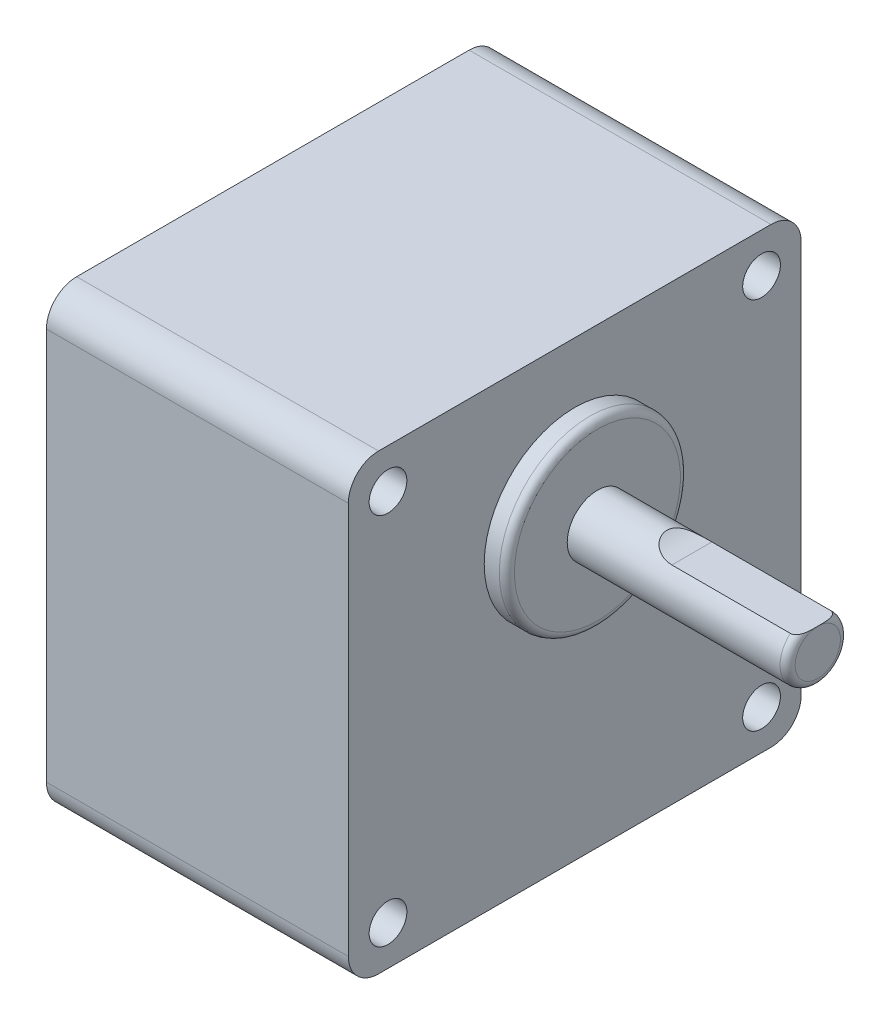
ISO-10303-21;
HEADER;
FILE_DESCRIPTION(('STEP AP214'),'2;1');
FILE_NAME('part.step','',(''),(''),'','','');
FILE_SCHEMA(('AUTOMOTIVE_DESIGN { 1 0 10303 214 1 1 1 1 }'));
ENDSEC;
DATA;
#1=APPLICATION_CONTEXT('core data for automotive mechanical design processes');
#2=APPLICATION_PROTOCOL_DEFINITION('international standard','automotive_design',2000,#1);
#3=PRODUCT_CONTEXT('',#1,'mechanical');
#4=PRODUCT('Part','Part','',(#3));
#5=PRODUCT_RELATED_PRODUCT_CATEGORY('part','',(#4));
#6=PRODUCT_DEFINITION_FORMATION('','',#4);
#7=PRODUCT_DEFINITION_CONTEXT('part definition',#1,'design');
#8=PRODUCT_DEFINITION('design','',#6,#7);
#9=PRODUCT_DEFINITION_SHAPE('','',#8);
#10=(LENGTH_UNIT() NAMED_UNIT(*) SI_UNIT(.MILLI.,.METRE.));
#11=(NAMED_UNIT(*) PLANE_ANGLE_UNIT() SI_UNIT($,.RADIAN.));
#12=(NAMED_UNIT(*) SI_UNIT($,.STERADIAN.) SOLID_ANGLE_UNIT());
#13=UNCERTAINTY_MEASURE_WITH_UNIT(LENGTH_MEASURE(1.E-05),#10,'distance_accuracy_value','');
#14=(GEOMETRIC_REPRESENTATION_CONTEXT(3) GLOBAL_UNCERTAINTY_ASSIGNED_CONTEXT((#13)) GLOBAL_UNIT_ASSIGNED_CONTEXT((#10,
#11,#12)) REPRESENTATION_CONTEXT('',''));
#15=CARTESIAN_POINT('',(0.,0.,0.));
#16=DIRECTION('',(0.,0.,1.));
#17=DIRECTION('',(1.,0.,0.));
#18=AXIS2_PLACEMENT_3D('',#15,#16,#17);
#19=CARTESIAN_POINT('',(-3.,0.,0.));
#20=DIRECTION('',(1.,0.,0.));
#21=DIRECTION('',(0.,0.,-1.));
#22=AXIS2_PLACEMENT_3D('',#19,#20,#21);
#23=PLANE('',#22);
#24=DIRECTION('',(0.,0.,-1.));
#25=VECTOR('',#24,1.);
#26=CARTESIAN_POINT('',(-3.,-40.,30.));
#27=LINE('',#26,#25);
#28=CARTESIAN_POINT('',(-3.,-40.,26.));
#29=VERTEX_POINT('',#28);
#30=CARTESIAN_POINT('',(-3.,-40.,-26.));
#31=VERTEX_POINT('',#30);
#32=EDGE_CURVE('E272',#29,#31,#27,.T.);
#33=ORIENTED_EDGE('',*,*,#32,.T.);
#34=CARTESIAN_POINT('',(-3.,-36.,-26.));
#35=DIRECTION('',(1.,0.,0.));
#36=DIRECTION('',(0.,0.,-1.));
#37=AXIS2_PLACEMENT_3D('',#34,#35,#36);
#38=CIRCLE('',#37,4.);
#39=CARTESIAN_POINT('',(-3.,-36.,-30.));
#40=VERTEX_POINT('',#39);
#41=EDGE_CURVE('E285',#31,#40,#38,.T.);
#42=ORIENTED_EDGE('',*,*,#41,.T.);
#43=DIRECTION('',(0.,1.,0.));
#44=VECTOR('',#43,1.);
#45=CARTESIAN_POINT('',(-3.,20.,-30.));
#46=LINE('',#45,#44);
#47=CARTESIAN_POINT('',(-3.,16.,-30.));
#48=VERTEX_POINT('',#47);
#49=EDGE_CURVE('E267',#40,#48,#46,.T.);
#50=ORIENTED_EDGE('',*,*,#49,.T.);
#51=CARTESIAN_POINT('',(-3.,16.,-26.));
#52=DIRECTION('',(1.,0.,0.));
#53=DIRECTION('',(0.,0.,-1.));
#54=AXIS2_PLACEMENT_3D('',#51,#52,#53);
#55=CIRCLE('',#54,4.);
#56=CARTESIAN_POINT('',(-3.,20.,-26.));
#57=VERTEX_POINT('',#56);
#58=EDGE_CURVE('E265',#48,#57,#55,.T.);
#59=ORIENTED_EDGE('',*,*,#58,.T.);
#60=DIRECTION('',(0.,0.,1.));
#61=VECTOR('',#60,1.);
#62=CARTESIAN_POINT('',(-3.,20.,30.));
#63=LINE('',#62,#61);
#64=CARTESIAN_POINT('',(-3.,20.,26.));
#65=VERTEX_POINT('',#64);
#66=EDGE_CURVE('E257',#57,#65,#63,.T.);
#67=ORIENTED_EDGE('',*,*,#66,.T.);
#68=CARTESIAN_POINT('',(-3.,16.,26.));
#69=DIRECTION('',(1.,0.,0.));
#70=DIRECTION('',(0.,0.,-1.));
#71=AXIS2_PLACEMENT_3D('',#68,#69,#70);
#72=CIRCLE('',#71,4.);
#73=CARTESIAN_POINT('',(-3.,16.,30.));
#74=VERTEX_POINT('',#73);
#75=EDGE_CURVE('E262',#65,#74,#72,.T.);
#76=ORIENTED_EDGE('',*,*,#75,.T.);
#77=DIRECTION('',(0.,-1.,0.));
#78=VECTOR('',#77,1.);
#79=CARTESIAN_POINT('',(-3.,20.,30.));
#80=LINE('',#79,#78);
#81=CARTESIAN_POINT('',(-3.,-36.,30.));
#82=VERTEX_POINT('',#81);
#83=EDGE_CURVE('E301',#74,#82,#80,.T.);
#84=ORIENTED_EDGE('',*,*,#83,.T.);
#85=CARTESIAN_POINT('',(-3.,-36.,26.));
#86=DIRECTION('',(1.,0.,0.));
#87=DIRECTION('',(0.,0.,-1.));
#88=AXIS2_PLACEMENT_3D('',#85,#86,#87);
#89=CIRCLE('',#88,4.);
#90=EDGE_CURVE('E283',#82,#29,#89,.T.);
#91=ORIENTED_EDGE('',*,*,#90,.T.);
#92=EDGE_LOOP('',(#33,#42,#50,#59,#67,#76,#84,#91));
#93=FACE_BOUND('',#92,.T.);
#94=CARTESIAN_POINT('',(-3.,14.75,24.7474746186353));
#95=DIRECTION('',(1.,0.,0.));
#96=DIRECTION('',(0.,0.,-1.));
#97=AXIS2_PLACEMENT_3D('',#94,#95,#96);
#98=CIRCLE('',#97,2.5);
#99=CARTESIAN_POINT('',(-3.,14.75,22.2474746186353));
#100=VERTEX_POINT('',#99);
#101=EDGE_CURVE('E304',#100,#100,#98,.T.);
#102=ORIENTED_EDGE('',*,*,#101,.F.);
#103=EDGE_LOOP('',(#102));
#104=FACE_BOUND('',#103,.T.);
#105=CARTESIAN_POINT('',(-3.,14.75,-24.7474746186353));
#106=DIRECTION('',(1.,0.,0.));
#107=DIRECTION('',(0.,0.,-1.));
#108=AXIS2_PLACEMENT_3D('',#105,#106,#107);
#109=CIRCLE('',#108,2.5);
#110=CARTESIAN_POINT('',(-3.,14.75,-27.2474746186353));
#111=VERTEX_POINT('',#110);
#112=EDGE_CURVE('E311',#111,#111,#109,.T.);
#113=ORIENTED_EDGE('',*,*,#112,.F.);
#114=EDGE_LOOP('',(#113));
#115=FACE_BOUND('',#114,.T.);
#116=CARTESIAN_POINT('',(-3.,-34.75,-24.7474746186353));
#117=DIRECTION('',(1.,0.,0.));
#118=DIRECTION('',(0.,0.,-1.));
#119=AXIS2_PLACEMENT_3D('',#116,#117,#118);
#120=CIRCLE('',#119,2.5);
#121=CARTESIAN_POINT('',(-3.,-34.75,-27.2474746186353));
#122=VERTEX_POINT('',#121);
#123=EDGE_CURVE('E317',#122,#122,#120,.T.);
#124=ORIENTED_EDGE('',*,*,#123,.F.);
#125=EDGE_LOOP('',(#124));
#126=FACE_BOUND('',#125,.T.);
#127=CARTESIAN_POINT('',(-3.,-34.75,24.7474746186353));
#128=DIRECTION('',(1.,0.,0.));
#129=DIRECTION('',(0.,0.,-1.));
#130=AXIS2_PLACEMENT_3D('',#127,#128,#129);
#131=CIRCLE('',#130,2.5);
#132=CARTESIAN_POINT('',(-3.,-34.75,22.2474746186353));
#133=VERTEX_POINT('',#132);
#134=EDGE_CURVE('E323',#133,#133,#131,.T.);
#135=ORIENTED_EDGE('',*,*,#134,.F.);
#136=EDGE_LOOP('',(#135));
#137=FACE_BOUND('',#136,.T.);
#138=CARTESIAN_POINT('',(-3.,0.,0.));
#139=DIRECTION('',(-1.,0.,0.));
#140=DIRECTION('',(0.,0.,1.));
#141=AXIS2_PLACEMENT_3D('',#138,#139,#140);
#142=CIRCLE('',#141,12.);
#143=CARTESIAN_POINT('',(-3.,0.,12.));
#144=VERTEX_POINT('',#143);
#145=EDGE_CURVE('E326',#144,#144,#142,.T.);
#146=ORIENTED_EDGE('',*,*,#145,.T.);
#147=EDGE_LOOP('',(#146));
#148=FACE_BOUND('',#147,.T.);
#149=ADVANCED_FACE('F36',(#93,#104,#115,#126,#137,#148),#23,.T.);
#150=CARTESIAN_POINT('',(-43.,20.,30.));
#151=DIRECTION('',(0.,0.,1.));
#152=DIRECTION('',(0.,-1.,0.));
#153=AXIS2_PLACEMENT_3D('',#150,#151,#152);
#154=PLANE('',#153);
#155=DIRECTION('',(0.,-1.,0.));
#156=VECTOR('',#155,1.);
#157=CARTESIAN_POINT('',(-43.,20.,30.));
#158=LINE('',#157,#156);
#159=CARTESIAN_POINT('',(-43.,16.,30.));
#160=VERTEX_POINT('',#159);
#161=CARTESIAN_POINT('',(-43.,-36.,30.));
#162=VERTEX_POINT('',#161);
#163=EDGE_CURVE('E266',#160,#162,#158,.T.);
#164=ORIENTED_EDGE('',*,*,#163,.T.);
#165=DIRECTION('',(1.,0.,0.));
#166=VECTOR('',#165,1.);
#167=CARTESIAN_POINT('',(-43.,-36.,30.));
#168=LINE('',#167,#166);
#169=EDGE_CURVE('E250',#162,#82,#168,.T.);
#170=ORIENTED_EDGE('',*,*,#169,.T.);
#171=ORIENTED_EDGE('',*,*,#83,.F.);
#172=DIRECTION('',(1.,0.,0.));
#173=VECTOR('',#172,1.);
#174=CARTESIAN_POINT('',(-43.,16.,30.));
#175=LINE('',#174,#173);
#176=EDGE_CURVE('E248',#74,#160,#175,.F.);
#177=ORIENTED_EDGE('',*,*,#176,.T.);
#178=EDGE_LOOP('',(#164,#170,#171,#177));
#179=FACE_BOUND('',#178,.T.);
#180=ADVANCED_FACE('F199',(#179),#154,.T.);
#181=CARTESIAN_POINT('',(-43.,20.,30.));
#182=DIRECTION('',(0.,1.,0.));
#183=DIRECTION('',(0.,0.,1.));
#184=AXIS2_PLACEMENT_3D('',#181,#182,#183);
#185=PLANE('',#184);
#186=DIRECTION('',(0.,0.,1.));
#187=VECTOR('',#186,1.);
#188=CARTESIAN_POINT('',(-43.,20.,30.));
#189=LINE('',#188,#187);
#190=CARTESIAN_POINT('',(-43.,20.,-26.));
#191=VERTEX_POINT('',#190);
#192=CARTESIAN_POINT('',(-43.,20.,26.));
#193=VERTEX_POINT('',#192);
#194=EDGE_CURVE('E258',#191,#193,#189,.T.);
#195=ORIENTED_EDGE('',*,*,#194,.T.);
#196=DIRECTION('',(1.,0.,0.));
#197=VECTOR('',#196,1.);
#198=CARTESIAN_POINT('',(-43.,20.,26.));
#199=LINE('',#198,#197);
#200=EDGE_CURVE('E140',#193,#65,#199,.T.);
#201=ORIENTED_EDGE('',*,*,#200,.T.);
#202=ORIENTED_EDGE('',*,*,#66,.F.);
#203=DIRECTION('',(1.,0.,0.));
#204=VECTOR('',#203,1.);
#205=CARTESIAN_POINT('',(-43.,20.,-26.));
#206=LINE('',#205,#204);
#207=EDGE_CURVE('E233',#57,#191,#206,.F.);
#208=ORIENTED_EDGE('',*,*,#207,.T.);
#209=EDGE_LOOP('',(#195,#201,#202,#208));
#210=FACE_BOUND('',#209,.T.);
#211=ADVANCED_FACE('F201',(#210),#185,.T.);
#212=CARTESIAN_POINT('',(-43.,20.,-30.));
#213=DIRECTION('',(0.,0.,-1.));
#214=DIRECTION('',(0.,1.,0.));
#215=AXIS2_PLACEMENT_3D('',#212,#213,#214);
#216=PLANE('',#215);
#217=ORIENTED_EDGE('',*,*,#49,.F.);
#218=DIRECTION('',(1.,0.,0.));
#219=VECTOR('',#218,1.);
#220=CARTESIAN_POINT('',(-43.,-36.,-30.));
#221=LINE('',#220,#219);
#222=CARTESIAN_POINT('',(-43.,-36.,-30.));
#223=VERTEX_POINT('',#222);
#224=EDGE_CURVE('E238',#40,#223,#221,.F.);
#225=ORIENTED_EDGE('',*,*,#224,.T.);
#226=DIRECTION('',(0.,1.,0.));
#227=VECTOR('',#226,1.);
#228=CARTESIAN_POINT('',(-43.,20.,-30.));
#229=LINE('',#228,#227);
#230=CARTESIAN_POINT('',(-43.,16.,-30.));
#231=VERTEX_POINT('',#230);
#232=EDGE_CURVE('E288',#223,#231,#229,.T.);
#233=ORIENTED_EDGE('',*,*,#232,.T.);
#234=DIRECTION('',(1.,0.,0.));
#235=VECTOR('',#234,1.);
#236=CARTESIAN_POINT('',(-43.,16.,-30.));
#237=LINE('',#236,#235);
#238=EDGE_CURVE('E235',#231,#48,#237,.T.);
#239=ORIENTED_EDGE('',*,*,#238,.T.);
#240=EDGE_LOOP('',(#217,#225,#233,#239));
#241=FACE_BOUND('',#240,.T.);
#242=ADVANCED_FACE('F204',(#241),#216,.T.);
#243=CARTESIAN_POINT('',(-43.,-40.,30.));
#244=DIRECTION('',(0.,-1.,0.));
#245=DIRECTION('',(0.,0.,-1.));
#246=AXIS2_PLACEMENT_3D('',#243,#244,#245);
#247=PLANE('',#246);
#248=DIRECTION('',(0.,0.,-1.));
#249=VECTOR('',#248,1.);
#250=CARTESIAN_POINT('',(-43.,-40.,30.));
#251=LINE('',#250,#249);
#252=CARTESIAN_POINT('',(-43.,-40.,26.));
#253=VERTEX_POINT('',#252);
#254=CARTESIAN_POINT('',(-43.,-40.,-26.));
#255=VERTEX_POINT('',#254);
#256=EDGE_CURVE('E270',#253,#255,#251,.T.);
#257=ORIENTED_EDGE('',*,*,#256,.T.);
#258=DIRECTION('',(1.,0.,0.));
#259=VECTOR('',#258,1.);
#260=CARTESIAN_POINT('',(-43.,-40.,-26.));
#261=LINE('',#260,#259);
#262=EDGE_CURVE('E278',#255,#31,#261,.T.);
#263=ORIENTED_EDGE('',*,*,#262,.T.);
#264=ORIENTED_EDGE('',*,*,#32,.F.);
#265=DIRECTION('',(1.,0.,0.));
#266=VECTOR('',#265,1.);
#267=CARTESIAN_POINT('',(-43.,-40.,26.));
#268=LINE('',#267,#266);
#269=EDGE_CURVE('E276',#29,#253,#268,.F.);
#270=ORIENTED_EDGE('',*,*,#269,.T.);
#271=EDGE_LOOP('',(#257,#263,#264,#270));
#272=FACE_BOUND('',#271,.T.);
#273=ADVANCED_FACE('F195',(#272),#247,.T.);
#274=CARTESIAN_POINT('',(-43.,0.,0.));
#275=DIRECTION('',(1.,0.,0.));
#276=DIRECTION('',(0.,0.,-1.));
#277=AXIS2_PLACEMENT_3D('',#274,#275,#276);
#278=PLANE('',#277);
#279=CARTESIAN_POINT('',(-43.,-10.,0.));
#280=DIRECTION('',(1.,0.,0.));
#281=DIRECTION('',(0.,0.,-1.));
#282=AXIS2_PLACEMENT_3D('',#279,#280,#281);
#283=CIRCLE('',#282,27.);
#284=CARTESIAN_POINT('',(-43.,-10.,-27.));
#285=VERTEX_POINT('',#284);
#286=EDGE_CURVE('E342',#285,#285,#283,.T.);
#287=ORIENTED_EDGE('',*,*,#286,.T.);
#288=EDGE_LOOP('',(#287));
#289=FACE_BOUND('',#288,.T.);
#290=CARTESIAN_POINT('',(-43.,-34.75,24.7474746186353));
#291=DIRECTION('',(1.,0.,0.));
#292=DIRECTION('',(0.,0.,-1.));
#293=AXIS2_PLACEMENT_3D('',#290,#291,#292);
#294=CIRCLE('',#293,2.5);
#295=CARTESIAN_POINT('',(-43.,-34.75,22.2474746186353));
#296=VERTEX_POINT('',#295);
#297=EDGE_CURVE('E320',#296,#296,#294,.T.);
#298=ORIENTED_EDGE('',*,*,#297,.T.);
#299=EDGE_LOOP('',(#298));
#300=FACE_BOUND('',#299,.T.);
#301=CARTESIAN_POINT('',(-43.,-34.75,-24.7474746186353));
#302=DIRECTION('',(1.,0.,0.));
#303=DIRECTION('',(0.,0.,-1.));
#304=AXIS2_PLACEMENT_3D('',#301,#302,#303);
#305=CIRCLE('',#304,2.5);
#306=CARTESIAN_POINT('',(-43.,-34.75,-27.2474746186353));
#307=VERTEX_POINT('',#306);
#308=EDGE_CURVE('E314',#307,#307,#305,.T.);
#309=ORIENTED_EDGE('',*,*,#308,.T.);
#310=EDGE_LOOP('',(#309));
#311=FACE_BOUND('',#310,.T.);
#312=CARTESIAN_POINT('',(-43.,14.75,-24.7474746186353));
#313=DIRECTION('',(1.,0.,0.));
#314=DIRECTION('',(0.,0.,-1.));
#315=AXIS2_PLACEMENT_3D('',#312,#313,#314);
#316=CIRCLE('',#315,2.5);
#317=CARTESIAN_POINT('',(-43.,14.75,-27.2474746186353));
#318=VERTEX_POINT('',#317);
#319=EDGE_CURVE('E309',#318,#318,#316,.T.);
#320=ORIENTED_EDGE('',*,*,#319,.T.);
#321=EDGE_LOOP('',(#320));
#322=FACE_BOUND('',#321,.T.);
#323=CARTESIAN_POINT('',(-43.,14.75,24.7474746186353));
#324=DIRECTION('',(1.,0.,0.));
#325=DIRECTION('',(0.,0.,-1.));
#326=AXIS2_PLACEMENT_3D('',#323,#324,#325);
#327=CIRCLE('',#326,2.5);
#328=CARTESIAN_POINT('',(-43.,14.75,22.2474746186353));
#329=VERTEX_POINT('',#328);
#330=EDGE_CURVE('E302',#329,#329,#327,.T.);
#331=ORIENTED_EDGE('',*,*,#330,.T.);
#332=EDGE_LOOP('',(#331));
#333=FACE_BOUND('',#332,.T.);
#334=ORIENTED_EDGE('',*,*,#232,.F.);
#335=CARTESIAN_POINT('',(-43.,-36.,-26.));
#336=DIRECTION('',(1.,0.,0.));
#337=DIRECTION('',(0.,0.,-1.));
#338=AXIS2_PLACEMENT_3D('',#335,#336,#337);
#339=CIRCLE('',#338,4.);
#340=EDGE_CURVE('E246',#223,#255,#339,.F.);
#341=ORIENTED_EDGE('',*,*,#340,.T.);
#342=ORIENTED_EDGE('',*,*,#256,.F.);
#343=CARTESIAN_POINT('',(-43.,-36.,26.));
#344=DIRECTION('',(1.,0.,0.));
#345=DIRECTION('',(0.,0.,-1.));
#346=AXIS2_PLACEMENT_3D('',#343,#344,#345);
#347=CIRCLE('',#346,4.);
#348=EDGE_CURVE('E240',#253,#162,#347,.F.);
#349=ORIENTED_EDGE('',*,*,#348,.T.);
#350=ORIENTED_EDGE('',*,*,#163,.F.);
#351=CARTESIAN_POINT('',(-43.,16.,26.));
#352=DIRECTION('',(1.,0.,0.));
#353=DIRECTION('',(0.,0.,-1.));
#354=AXIS2_PLACEMENT_3D('',#351,#352,#353);
#355=CIRCLE('',#354,4.);
#356=EDGE_CURVE('E64',#160,#193,#355,.F.);
#357=ORIENTED_EDGE('',*,*,#356,.T.);
#358=ORIENTED_EDGE('',*,*,#194,.F.);
#359=CARTESIAN_POINT('',(-43.,16.,-26.));
#360=DIRECTION('',(1.,0.,0.));
#361=DIRECTION('',(0.,0.,-1.));
#362=AXIS2_PLACEMENT_3D('',#359,#360,#361);
#363=CIRCLE('',#362,4.);
#364=EDGE_CURVE('E232',#191,#231,#363,.F.);
#365=ORIENTED_EDGE('',*,*,#364,.T.);
#366=EDGE_LOOP('',(#334,#341,#342,#349,#350,#357,#358,#365));
#367=FACE_BOUND('',#366,.T.);
#368=ADVANCED_FACE('F191',(#289,#300,#311,#322,#333,#367),#278,.F.);
#369=CARTESIAN_POINT('',(-43.,14.75,24.7474746186353));
#370=DIRECTION('',(1.,0.,0.));
#371=DIRECTION('',(0.,0.,-1.));
#372=AXIS2_PLACEMENT_3D('',#369,#370,#371);
#373=CYLINDRICAL_SURFACE('',#372,2.5);
#374=ORIENTED_EDGE('',*,*,#330,.F.);
#375=EDGE_LOOP('',(#374));
#376=FACE_BOUND('',#375,.T.);
#377=ORIENTED_EDGE('',*,*,#101,.T.);
#378=EDGE_LOOP('',(#377));
#379=FACE_BOUND('',#378,.T.);
#380=ADVANCED_FACE('F187',(#376,#379),#373,.F.);
#381=CARTESIAN_POINT('',(-43.,14.75,-24.7474746186353));
#382=DIRECTION('',(1.,0.,0.));
#383=DIRECTION('',(0.,0.,-1.));
#384=AXIS2_PLACEMENT_3D('',#381,#382,#383);
#385=CYLINDRICAL_SURFACE('',#384,2.5);
#386=ORIENTED_EDGE('',*,*,#319,.F.);
#387=EDGE_LOOP('',(#386));
#388=FACE_BOUND('',#387,.T.);
#389=ORIENTED_EDGE('',*,*,#112,.T.);
#390=EDGE_LOOP('',(#389));
#391=FACE_BOUND('',#390,.T.);
#392=ADVANCED_FACE('F183',(#388,#391),#385,.F.);
#393=CARTESIAN_POINT('',(-43.,-34.75,-24.7474746186353));
#394=DIRECTION('',(1.,0.,0.));
#395=DIRECTION('',(0.,0.,-1.));
#396=AXIS2_PLACEMENT_3D('',#393,#394,#395);
#397=CYLINDRICAL_SURFACE('',#396,2.5);
#398=ORIENTED_EDGE('',*,*,#308,.F.);
#399=EDGE_LOOP('',(#398));
#400=FACE_BOUND('',#399,.T.);
#401=ORIENTED_EDGE('',*,*,#123,.T.);
#402=EDGE_LOOP('',(#401));
#403=FACE_BOUND('',#402,.T.);
#404=ADVANCED_FACE('F179',(#400,#403),#397,.F.);
#405=CARTESIAN_POINT('',(-43.,-34.75,24.7474746186353));
#406=DIRECTION('',(1.,0.,0.));
#407=DIRECTION('',(0.,0.,-1.));
#408=AXIS2_PLACEMENT_3D('',#405,#406,#407);
#409=CYLINDRICAL_SURFACE('',#408,2.5);
#410=ORIENTED_EDGE('',*,*,#297,.F.);
#411=EDGE_LOOP('',(#410));
#412=FACE_BOUND('',#411,.T.);
#413=ORIENTED_EDGE('',*,*,#134,.T.);
#414=EDGE_LOOP('',(#413));
#415=FACE_BOUND('',#414,.T.);
#416=ADVANCED_FACE('F175',(#412,#415),#409,.F.);
#417=CARTESIAN_POINT('',(-43.,-36.,-26.));
#418=DIRECTION('',(1.,0.,0.));
#419=DIRECTION('',(0.,0.,-1.));
#420=AXIS2_PLACEMENT_3D('',#417,#418,#419);
#421=CYLINDRICAL_SURFACE('',#420,4.);
#422=ORIENTED_EDGE('',*,*,#340,.F.);
#423=ORIENTED_EDGE('',*,*,#224,.F.);
#424=ORIENTED_EDGE('',*,*,#41,.F.);
#425=ORIENTED_EDGE('',*,*,#262,.F.);
#426=EDGE_LOOP('',(#422,#423,#424,#425));
#427=FACE_BOUND('',#426,.T.);
#428=ADVANCED_FACE('F178',(#427),#421,.T.);
#429=CARTESIAN_POINT('',(-43.,-36.,26.));
#430=DIRECTION('',(1.,0.,0.));
#431=DIRECTION('',(0.,0.,-1.));
#432=AXIS2_PLACEMENT_3D('',#429,#430,#431);
#433=CYLINDRICAL_SURFACE('',#432,4.);
#434=ORIENTED_EDGE('',*,*,#348,.F.);
#435=ORIENTED_EDGE('',*,*,#269,.F.);
#436=ORIENTED_EDGE('',*,*,#90,.F.);
#437=ORIENTED_EDGE('',*,*,#169,.F.);
#438=EDGE_LOOP('',(#434,#435,#436,#437));
#439=FACE_BOUND('',#438,.T.);
#440=ADVANCED_FACE('F217',(#439),#433,.T.);
#441=CARTESIAN_POINT('',(-43.,16.,26.));
#442=DIRECTION('',(1.,0.,0.));
#443=DIRECTION('',(0.,0.,-1.));
#444=AXIS2_PLACEMENT_3D('',#441,#442,#443);
#445=CYLINDRICAL_SURFACE('',#444,4.);
#446=ORIENTED_EDGE('',*,*,#356,.F.);
#447=ORIENTED_EDGE('',*,*,#176,.F.);
#448=ORIENTED_EDGE('',*,*,#75,.F.);
#449=ORIENTED_EDGE('',*,*,#200,.F.);
#450=EDGE_LOOP('',(#446,#447,#448,#449));
#451=FACE_BOUND('',#450,.T.);
#452=ADVANCED_FACE('F221',(#451),#445,.T.);
#453=CARTESIAN_POINT('',(-43.,16.,-26.));
#454=DIRECTION('',(1.,0.,0.));
#455=DIRECTION('',(0.,0.,-1.));
#456=AXIS2_PLACEMENT_3D('',#453,#454,#455);
#457=CYLINDRICAL_SURFACE('',#456,4.);
#458=ORIENTED_EDGE('',*,*,#364,.F.);
#459=ORIENTED_EDGE('',*,*,#207,.F.);
#460=ORIENTED_EDGE('',*,*,#58,.F.);
#461=ORIENTED_EDGE('',*,*,#238,.F.);
#462=EDGE_LOOP('',(#458,#459,#460,#461));
#463=FACE_BOUND('',#462,.T.);
#464=ADVANCED_FACE('F173',(#463),#457,.T.);
#465=CARTESIAN_POINT('',(-3.,0.,0.));
#466=DIRECTION('',(-1.,0.,0.));
#467=DIRECTION('',(0.,0.,1.));
#468=AXIS2_PLACEMENT_3D('',#465,#466,#467);
#469=CYLINDRICAL_SURFACE('',#468,12.);
#470=CARTESIAN_POINT('',(-1.,0.,0.));
#471=DIRECTION('',(-1.,0.,0.));
#472=DIRECTION('',(0.,0.,1.));
#473=AXIS2_PLACEMENT_3D('',#470,#471,#472);
#474=CIRCLE('',#473,12.);
#475=CARTESIAN_POINT('',(-1.,0.,12.));
#476=VERTEX_POINT('',#475);
#477=EDGE_CURVE('E136',#476,#476,#474,.T.);
#478=ORIENTED_EDGE('',*,*,#477,.T.);
#479=EDGE_LOOP('',(#478));
#480=FACE_BOUND('',#479,.T.);
#481=ORIENTED_EDGE('',*,*,#145,.F.);
#482=EDGE_LOOP('',(#481));
#483=FACE_BOUND('',#482,.T.);
#484=ADVANCED_FACE('F169',(#480,#483),#469,.T.);
#485=CARTESIAN_POINT('',(0.,12.,0.));
#486=DIRECTION('',(-1.,0.,0.));
#487=DIRECTION('',(0.,0.,1.));
#488=AXIS2_PLACEMENT_3D('',#485,#486,#487);
#489=PLANE('',#488);
#490=CARTESIAN_POINT('',(0.,0.,0.));
#491=DIRECTION('',(-1.,0.,0.));
#492=DIRECTION('',(0.,0.,1.));
#493=AXIS2_PLACEMENT_3D('',#490,#491,#492);
#494=CIRCLE('',#493,11.);
#495=CARTESIAN_POINT('',(0.,0.,11.));
#496=VERTEX_POINT('',#495);
#497=EDGE_CURVE('E129',#496,#496,#494,.F.);
#498=ORIENTED_EDGE('',*,*,#497,.T.);
#499=EDGE_LOOP('',(#498));
#500=FACE_BOUND('',#499,.T.);
#501=CARTESIAN_POINT('',(0.,0.,0.));
#502=DIRECTION('',(-1.,0.,0.));
#503=DIRECTION('',(0.,0.,1.));
#504=AXIS2_PLACEMENT_3D('',#501,#502,#503);
#505=CIRCLE('',#504,4.);
#506=CARTESIAN_POINT('',(0.,0.,4.));
#507=VERTEX_POINT('',#506);
#508=EDGE_CURVE('E331',#507,#507,#505,.T.);
#509=ORIENTED_EDGE('',*,*,#508,.T.);
#510=EDGE_LOOP('',(#509));
#511=FACE_BOUND('',#510,.T.);
#512=ADVANCED_FACE('F165',(#500,#511),#489,.F.);
#513=CARTESIAN_POINT('',(-3.,0.,0.));
#514=DIRECTION('',(-1.,0.,0.));
#515=DIRECTION('',(0.,0.,1.));
#516=AXIS2_PLACEMENT_3D('',#513,#514,#515);
#517=CYLINDRICAL_SURFACE('',#516,4.);
#518=CARTESIAN_POINT('',(28.2,0.,0.));
#519=DIRECTION('',(-1.,0.,0.));
#520=DIRECTION('',(0.,0.,1.));
#521=AXIS2_PLACEMENT_3D('',#518,#519,#520);
#522=CIRCLE('',#521,4.);
#523=CARTESIAN_POINT('',(28.2,3.,-2.64575131106459));
#524=VERTEX_POINT('',#523);
#525=CARTESIAN_POINT('',(28.2,3.,2.64575131106459));
#526=VERTEX_POINT('',#525);
#527=EDGE_CURVE('E133',#524,#526,#522,.T.);
#528=ORIENTED_EDGE('',*,*,#527,.T.);
#529=DIRECTION('',(-1.,0.,0.));
#530=VECTOR('',#529,1.);
#531=CARTESIAN_POINT('',(-3.,3.,2.64575131106459));
#532=LINE('',#531,#530);
#533=CARTESIAN_POINT('',(12.5166247903554,3.,2.64575131106459));
#534=VERTEX_POINT('',#533);
#535=EDGE_CURVE('E56',#526,#534,#532,.T.);
#536=ORIENTED_EDGE('',*,*,#535,.T.);
#537=CARTESIAN_POINT('',(12.5166247903554,3.,2.64575131106459));
#538=CARTESIAN_POINT('',(12.4136538584303,2.99998383027069,2.64573001972438));
#539=CARTESIAN_POINT('',(12.3106765436204,3.00265019485115,2.64274475950422));
#540=CARTESIAN_POINT('',(12.1053085310481,3.01323596685791,2.63068995961199));
#541=CARTESIAN_POINT('',(12.002918091898,3.02115753375473,2.62161791873938));
#542=CARTESIAN_POINT('',(11.7985627047307,3.04222876761484,2.59713158043446));
#543=CARTESIAN_POINT('',(11.6966083770751,3.05542136621863,2.58166516504327));
#544=CARTESIAN_POINT('',(11.494714928204,3.08678340880468,2.54408556057046));
#545=CARTESIAN_POINT('',(11.3947755846418,3.10495230040734,2.52197310918715));
#546=CARTESIAN_POINT('',(11.1973078477717,3.14597505685404,2.47061211112231));
#547=CARTESIAN_POINT('',(11.0997897824372,3.16884606408848,2.44133737669612));
#548=CARTESIAN_POINT('',(10.9084375596763,3.21869336734296,2.37523194328886));
#549=CARTESIAN_POINT('',(10.8146028163236,3.24566900706005,2.33840245193513));
#550=CARTESIAN_POINT('',(10.6319112011874,3.3028975376992,2.25684251005795));
#551=CARTESIAN_POINT('',(10.5430367682876,3.33313758539306,2.21214261533871));
#552=CARTESIAN_POINT('',(10.3709921873079,3.39601411324055,2.11434758133988));
#553=CARTESIAN_POINT('',(10.2878195319304,3.42864952681313,2.06125616653873));
#554=CARTESIAN_POINT('',(10.0948518296624,3.50909969296611,1.92226035394835));
#555=CARTESIAN_POINT('',(9.98845093095803,3.55756002575154,1.83191379176026));
#556=CARTESIAN_POINT('',(9.79264111222042,3.65286902892396,1.63358947069156));
#557=CARTESIAN_POINT('',(9.70322877371889,3.69971802199042,1.52561526702368));
#558=CARTESIAN_POINT('',(9.54392117332667,3.78738267809089,1.29277492349889));
#559=CARTESIAN_POINT('',(9.47414620523784,3.82816046339051,1.16781133992832));
#560=CARTESIAN_POINT('',(9.35728852869888,3.89869529744437,0.904795736967402));
#561=CARTESIAN_POINT('',(9.31019659722398,3.92845682431722,0.766749064590621));
#562=CARTESIAN_POINT('',(9.24396883016914,3.97097442568444,0.497854298213129));
#563=CARTESIAN_POINT('',(9.22235645300397,3.98522385391999,0.367847309186424));
#564=CARTESIAN_POINT('',(9.1988053666177,4.00077117944517,0.105315820299479));
#565=CARTESIAN_POINT('',(9.19685919597173,4.00207398872245,-0.0272077056572965));
#566=CARTESIAN_POINT('',(9.21224231205974,3.99189460422197,-0.283458487839485));
#567=CARTESIAN_POINT('',(9.22854478490291,3.98109344007638,-0.407276704590676));
#568=CARTESIAN_POINT('',(9.27845588891003,3.94874890437758,-0.649889503962618));
#569=CARTESIAN_POINT('',(9.31206222042854,3.92720696026287,-0.76868475185551));
#570=CARTESIAN_POINT('',(9.39618669047525,3.87503022843048,-0.999109337986993));
#571=CARTESIAN_POINT('',(9.4468398467652,3.84432307541659,-1.11067270652309));
#572=CARTESIAN_POINT('',(9.56375888828572,3.77648250570221,-1.32311493867474));
#573=CARTESIAN_POINT('',(9.63002777219964,3.73934785509539,-1.42399174475304));
#574=CARTESIAN_POINT('',(9.78130931787717,3.65904255603775,-1.61966819466595));
#575=CARTESIAN_POINT('',(9.86726405856917,3.61563602181559,-1.71363954059138));
#576=CARTESIAN_POINT('',(10.0526159882186,3.52833100047662,-1.88687920001364));
#577=CARTESIAN_POINT('',(10.1520182723785,3.48443233270333,-1.96614191335864));
#578=CARTESIAN_POINT('',(10.3758378223858,3.39344327328272,-2.1198045285923));
#579=CARTESIAN_POINT('',(10.5018221459682,3.34671386863795,-2.19212825252255));
#580=CARTESIAN_POINT('',(10.7644537955351,3.25987094165043,-2.31930579510048));
#581=CARTESIAN_POINT('',(10.9011105026929,3.21976333861326,-2.37414402359735));
#582=CARTESIAN_POINT('',(11.2082209470434,3.14187665045278,-2.47659487070213));
#583=CARTESIAN_POINT('',(11.3802225416669,3.10592893964058,-2.5209491971472));
#584=CARTESIAN_POINT('',(11.7305237601531,3.04907291144723,-2.58942771779797));
#585=CARTESIAN_POINT('',(11.9088210477978,3.02815907553722,-2.61355933575278));
#586=CARTESIAN_POINT('',(12.1595059666202,3.01020955550544,-2.6341366224543));
#587=CARTESIAN_POINT('',(12.2308849266795,3.00638032108773,-2.63850190054129));
#588=CARTESIAN_POINT('',(12.3737105088468,3.00127813630024,-2.64430415870325));
#589=CARTESIAN_POINT('',(12.4451567128084,3.00000010808722,-2.64574695568015));
#590=CARTESIAN_POINT('',(12.5166247903554,3.,-2.64575131106459));
#591=B_SPLINE_CURVE_WITH_KNOTS('',3,(#537,#538,#539,#540,#541,#542,#543,#544,#545,#546,#547,
#548,#549,#550,#551,#552,#553,#554,#555,#556,#557,#558,#559,#560,#561,#562,#563,#564,#565,#566,
#567,#568,#569,#570,#571,#572,#573,#574,#575,#576,#577,#578,#579,#580,#581,#582,#583,#584,#585,
#586,#587,#588,#589,#590),.UNSPECIFIED.,.F.,.F.,(4,2,2,2,2,2,2,2,2,2,2,2,2,2,2,2,2,2,2,2,2,2,2,
2,2,2,4),(0.,0.308845438814936,0.617817867236374,0.92935986697504,1.2408672988635,
1.55353119133278,1.86614514339464,2.17757114938831,2.48885931872161,2.93019371985333,
3.37143922062241,3.81533160502301,4.25904334810387,4.65467030467681,5.05014715341399,
5.42444219323203,5.79868750288202,6.17596961961156,6.55332424483479,6.9553458235222,
7.35752015490049,7.81360617846078,8.27009772070502,8.81177965725613,9.35326265534368,
9.56802462429468,9.78235870964098),.UNSPECIFIED.);
#592=CARTESIAN_POINT('',(12.5166247903554,3.,-2.64575131106459));
#593=VERTEX_POINT('',#592);
#594=EDGE_CURVE('E11',#534,#593,#591,.T.);
#595=ORIENTED_EDGE('',*,*,#594,.T.);
#596=DIRECTION('',(-1.,0.,0.));
#597=VECTOR('',#596,1.);
#598=CARTESIAN_POINT('',(-3.,3.,-2.64575131106459));
#599=LINE('',#598,#597);
#600=EDGE_CURVE('E335',#593,#524,#599,.F.);
#601=ORIENTED_EDGE('',*,*,#600,.T.);
#602=EDGE_LOOP('',(#528,#536,#595,#601));
#603=FACE_BOUND('',#602,.T.);
#604=ORIENTED_EDGE('',*,*,#508,.F.);
#605=EDGE_LOOP('',(#604));
#606=FACE_BOUND('',#605,.T.);
#607=ADVANCED_FACE('F161',(#603,#606),#517,.T.);
#608=CARTESIAN_POINT('',(29.2,4.,0.));
#609=DIRECTION('',(-1.,0.,0.));
#610=DIRECTION('',(0.,0.,1.));
#611=AXIS2_PLACEMENT_3D('',#608,#609,#610);
#612=PLANE('',#611);
#613=CARTESIAN_POINT('',(29.2,0.,0.));
#614=DIRECTION('',(-1.,0.,0.));
#615=DIRECTION('',(0.,0.,1.));
#616=AXIS2_PLACEMENT_3D('',#613,#614,#615);
#617=CIRCLE('',#616,3.);
#618=CARTESIAN_POINT('',(29.2,3.,0.));
#619=VERTEX_POINT('',#618);
#620=EDGE_CURVE('E132',#619,#619,#617,.F.);
#621=ORIENTED_EDGE('',*,*,#620,.T.);
#622=EDGE_LOOP('',(#621));
#623=FACE_BOUND('',#622,.T.);
#624=ADVANCED_FACE('F135',(#623),#612,.F.);
#625=CARTESIAN_POINT('',(28.2,0.,0.));
#626=DIRECTION('',(-1.,0.,0.));
#627=DIRECTION('',(0.,0.,1.));
#628=AXIS2_PLACEMENT_3D('',#625,#626,#627);
#629=TOROIDAL_SURFACE('',#628,3.,1.);
#630=CARTESIAN_POINT('',(29.2000000000001,3.,0.));
#631=CARTESIAN_POINT('',(29.2000016977411,3.,-0.0852610584491964));
#632=CARTESIAN_POINT('',(29.2000203462335,3.,-0.17052209822357));
#633=CARTESIAN_POINT('',(29.1998611730622,3.,-0.341051157713523));
#634=CARTESIAN_POINT('',(29.1996833356789,3.,-0.426319177441771));
#635=CARTESIAN_POINT('',(29.1984371305372,3.,-0.597280611135538));
#636=CARTESIAN_POINT('',(29.1973642867878,3.,-0.682974006930087));
#637=CARTESIAN_POINT('',(29.1932232955639,3.,-0.854310196754409));
#638=CARTESIAN_POINT('',(29.1901554453915,3.,-0.939952996421089));
#639=CARTESIAN_POINT('',(29.1807052968102,3.,-1.10885802557892));
#640=CARTESIAN_POINT('',(29.1744105549233,3.,-1.19212466552495));
#641=CARTESIAN_POINT('',(29.1569307829293,3.,-1.35824532496397));
#642=CARTESIAN_POINT('',(29.1457420901462,3.,-1.44109898831926));
#643=CARTESIAN_POINT('',(29.1166989181295,3.,-1.60492550873509));
#644=CARTESIAN_POINT('',(29.0989038253969,3.,-1.68590849211786));
#645=CARTESIAN_POINT('',(29.0545163049529,3.,-1.84537719029806));
#646=CARTESIAN_POINT('',(29.0279443228388,3.,-1.9238682485372));
#647=CARTESIAN_POINT('',(28.9820966043351,3.,-2.03247686299745));
#648=CARTESIAN_POINT('',(28.9673740246382,3.,-2.06452438642263));
#649=CARTESIAN_POINT('',(28.9357035741123,3.,-2.12752656092854));
#650=CARTESIAN_POINT('',(28.9187537764188,3.,-2.15848023590661));
#651=CARTESIAN_POINT('',(28.8642926211878,3.,-2.24919224803636));
#652=CARTESIAN_POINT('',(28.8231325811662,3.,-2.30689328799089));
#653=CARTESIAN_POINT('',(28.7452440821551,3.,-2.39581851263719));
#654=CARTESIAN_POINT('',(28.7113933197625,3.,-2.42956754607536));
#655=CARTESIAN_POINT('',(28.638797344574,3.,-2.49136343356622));
#656=CARTESIAN_POINT('',(28.6000573443125,3.,-2.51941627856844));
#657=CARTESIAN_POINT('',(28.5244378460058,3.,-2.56440807641849));
#658=CARTESIAN_POINT('',(28.4881828070299,3.,-2.58239133364661));
#659=CARTESIAN_POINT('',(28.4131717189889,3.,-2.61206155681229));
#660=CARTESIAN_POINT('',(28.3744173048627,3.,-2.62375259288272));
#661=CARTESIAN_POINT('',(28.2952490239129,3.,-2.64009768370908));
#662=CARTESIAN_POINT('',(28.2548284239134,3.,-2.64471956024537));
#663=CARTESIAN_POINT('',(28.1738216726695,3.,-2.64647279983798));
#664=CARTESIAN_POINT('',(28.1332355304398,3.,-2.64360456547348));
#665=CARTESIAN_POINT('',(28.0563319270108,3.,-2.63110295569683));
#666=CARTESIAN_POINT('',(28.0199254222759,3.,-2.62200386323991));
#667=CARTESIAN_POINT('',(27.9490298522066,3.,-2.59816607289154));
#668=CARTESIAN_POINT('',(27.9145407626505,3.,-2.58342744626039));
#669=CARTESIAN_POINT('',(27.8460840168918,3.,-2.54802177928429));
#670=CARTESIAN_POINT('',(27.8122761576093,3.,-2.52704824917731));
#671=CARTESIAN_POINT('',(27.7479245436005,3.,-2.48058892959271));
#672=CARTESIAN_POINT('',(27.7173836379655,3.,-2.45509925223901));
#673=CARTESIAN_POINT('',(27.6432903671484,3.,-2.38499347114412));
#674=CARTESIAN_POINT('',(27.6022231101396,3.,-2.3377473007347));
#675=CARTESIAN_POINT('',(27.5281300025472,3.,-2.23737788571171));
#676=CARTESIAN_POINT('',(27.4951171678246,3.,-2.18424532757028));
#677=CARTESIAN_POINT('',(27.4422148892459,3.,-2.08536513149321));
#678=CARTESIAN_POINT('',(27.4210216470774,3.,-2.04029822011981));
#679=CARTESIAN_POINT('',(27.3826460349208,3.,-1.9484634897417));
#680=CARTESIAN_POINT('',(27.3654667625575,3.,-1.90169438909473));
#681=CARTESIAN_POINT('',(27.3345689462457,3.,-1.80688989366263));
#682=CARTESIAN_POINT('',(27.3208608569541,3.,-1.75885114366317));
#683=CARTESIAN_POINT('',(27.296478890483,3.,-1.66206079337122));
#684=CARTESIAN_POINT('',(27.2858027481301,3.,-1.6133097540156));
#685=CARTESIAN_POINT('',(27.2581671902273,3.,-1.46933507815078));
#686=CARTESIAN_POINT('',(27.2447162559974,3.,-1.37344243029008));
#687=CARTESIAN_POINT('',(27.2243655458554,3.,-1.18093941636152));
#688=CARTESIAN_POINT('',(27.2174736556493,3.,-1.08432832675091));
#689=CARTESIAN_POINT('',(27.2077519569091,3.,-0.890525017954309));
#690=CARTESIAN_POINT('',(27.2049390751559,3.,-0.793332048323548));
#691=CARTESIAN_POINT('',(27.2014250021745,3.,-0.598966807399191));
#692=CARTESIAN_POINT('',(27.2007228439596,3.,-0.501794547027039));
#693=CARTESIAN_POINT('',(27.2000113983655,3.,-0.306419494101206));
#694=CARTESIAN_POINT('',(27.200009532648,3.,-0.208216693762017));
#695=CARTESIAN_POINT('',(27.1999945328044,3.,-0.0118003897514145));
#696=CARTESIAN_POINT('',(27.1999813974418,3.,0.0864131139119702));
#697=CARTESIAN_POINT('',(27.2000507424049,3.,0.282628223894067));
#698=CARTESIAN_POINT('',(27.2001330164967,3.,0.380629830206927));
#699=CARTESIAN_POINT('',(27.2013069911029,3.,0.57662269916011));
#700=CARTESIAN_POINT('',(27.2023986017873,3.,0.674613961944814));
#701=CARTESIAN_POINT('',(27.207203204,3.,0.870449829135943));
#702=CARTESIAN_POINT('',(27.2109135682846,3.,0.968294482119457));
#703=CARTESIAN_POINT('',(27.223154291593,3.,1.16384102303749));
#704=CARTESIAN_POINT('',(27.2316902982107,3.,1.26154260897067));
#705=CARTESIAN_POINT('',(27.2561609693505,3.,1.45482854173121));
#706=CARTESIAN_POINT('',(27.2720009076,3.,1.55042404792728));
#707=CARTESIAN_POINT('',(27.3141726045736,3.,1.73920385252844));
#708=CARTESIAN_POINT('',(27.3404777233988,3.,1.83239363833504));
#709=CARTESIAN_POINT('',(27.3992425813248,3.,1.99205517584106));
#710=CARTESIAN_POINT('',(27.4287364941806,3.,2.05959676420103));
#711=CARTESIAN_POINT('',(27.49770427497,3.,2.18961664206244));
#712=CARTESIAN_POINT('',(27.5371793651801,3.,2.25209431020728));
#713=CARTESIAN_POINT('',(27.613109360937,3.,2.34984147573418));
#714=CARTESIAN_POINT('',(27.6465399233058,3.,2.38744921251823));
#715=CARTESIAN_POINT('',(27.7188456400538,3.,2.45700818592928));
#716=CARTESIAN_POINT('',(27.7577115479412,3.,2.48896882452998));
#717=CARTESIAN_POINT('',(27.8333996562299,3.,2.54049210140623));
#718=CARTESIAN_POINT('',(27.8694082414485,3.,2.56124350443788));
#719=CARTESIAN_POINT('',(27.9443893722778,3.,2.59650028203201));
#720=CARTESIAN_POINT('',(27.9833606760059,3.,2.6110082568509));
#721=CARTESIAN_POINT('',(28.0635278416752,3.,2.63287273742408));
#722=CARTESIAN_POINT('',(28.1047351755722,3.,2.64018776925398));
#723=CARTESIAN_POINT('',(28.1877901202869,3.,2.64694488510456));
#724=CARTESIAN_POINT('',(28.229637499263,3.,2.64638975546169));
#725=CARTESIAN_POINT('',(28.3084279566914,3.,2.63790267807119));
#726=CARTESIAN_POINT('',(28.3454518747036,3.,2.63069413733558));
#727=CARTESIAN_POINT('',(28.4178270196525,3.,2.61037380556937));
#728=CARTESIAN_POINT('',(28.453178173757,3.,2.59726175776126));
#729=CARTESIAN_POINT('',(28.5227291298404,3.,2.56527662955415));
#730=CARTESIAN_POINT('',(28.5568389001843,3.,2.54620957119344));
#731=CARTESIAN_POINT('',(28.6219917392194,3.,2.50343570101595));
#732=CARTESIAN_POINT('',(28.6530331863025,3.,2.47972645532554));
#733=CARTESIAN_POINT('',(28.7272669992627,3.,2.41514829294856));
#734=CARTESIAN_POINT('',(28.76830482318,3.,2.37179709016206));
#735=CARTESIAN_POINT('',(28.8429413938281,3.,2.27910840280452));
#736=CARTESIAN_POINT('',(28.8765212878566,3.,2.22975622458876));
#737=CARTESIAN_POINT('',(28.9536646139655,3.,2.0986126646748));
#738=CARTESIAN_POINT('',(28.9924366246227,3.,2.01401009551798));
#739=CARTESIAN_POINT('',(29.0407343536075,3.,1.8837433167653));
#740=CARTESIAN_POINT('',(29.0551962561304,3.,1.83973157097536));
#741=CARTESIAN_POINT('',(29.0812678693787,3.,1.75088010312406));
#742=CARTESIAN_POINT('',(29.0928789957587,3.,1.70604080395662));
#743=CARTESIAN_POINT('',(29.1186873397533,3.,1.59388644735924));
#744=CARTESIAN_POINT('',(29.1314005053992,3.,1.52623513055903));
#745=CARTESIAN_POINT('',(29.1525814406181,3.,1.39025745819199));
#746=CARTESIAN_POINT('',(29.1610465828126,3.,1.32193071144595));
#747=CARTESIAN_POINT('',(29.1747759076268,3.,1.18478160769518));
#748=CARTESIAN_POINT('',(29.1800312647045,3.,1.11595840601113));
#749=CARTESIAN_POINT('',(29.1882194909427,3.,0.978171447383864));
#750=CARTESIAN_POINT('',(29.1911519398185,3.,0.909207667267687));
#751=CARTESIAN_POINT('',(29.1955109627849,3.,0.770144007499501));
#752=CARTESIAN_POINT('',(29.196912941564,3.,0.700043439685569));
#753=CARTESIAN_POINT('',(29.1988022567528,3.,0.559829852383403));
#754=CARTESIAN_POINT('',(29.1992895572201,3.,0.489716832514129));
#755=CARTESIAN_POINT('',(29.199856754903,3.,0.34966959228749));
#756=CARTESIAN_POINT('',(29.199937693039,3.,0.279735374213619));
#757=CARTESIAN_POINT('',(29.2000086190132,3.,0.139867433238613));
#758=CARTESIAN_POINT('',(29.1999986074614,3.,0.0699337103373027));
#759=CARTESIAN_POINT('',(29.2000000000001,3.,0.));
#760=B_SPLINE_CURVE_WITH_KNOTS('',3,(#630,#631,#632,#633,#634,#635,#636,#637,#638,#639,#640,
#641,#642,#643,#644,#645,#646,#647,#648,#649,#650,#651,#652,#653,#654,#655,#656,#657,#658,#659,
#660,#661,#662,#663,#664,#665,#666,#667,#668,#669,#670,#671,#672,#673,#674,#675,#676,#677,#678,
#679,#680,#681,#682,#683,#684,#685,#686,#687,#688,#689,#690,#691,#692,#693,#694,#695,#696,#697,
#698,#699,#700,#701,#702,#703,#704,#705,#706,#707,#708,#709,#710,#711,#712,#713,#714,#715,#716,
#717,#718,#719,#720,#721,#722,#723,#724,#725,#726,#727,#728,#729,#730,#731,#732,#733,#734,#735,
#736,#737,#738,#739,#740,#741,#742,#743,#744,#745,#746,#747,#748,#749,#750,#751,#752,#753,#754,
#755,#756,#757,#758,#759),.UNSPECIFIED.,.T.,.F.,(4,2,2,2,2,2,2,2,2,2,2,2,2,2,2,2,2,2,2,2,2,2,2,
2,2,2,2,2,2,2,2,2,2,2,2,2,2,2,2,2,2,2,2,2,2,2,2,2,2,2,2,2,2,2,2,2,2,2,2,2,2,2,2,2,4),(0.,
0.255783224022907,0.511586912865464,0.768677617392764,1.02573001824398,1.27615034327144,
1.5267584066143,1.77516619041393,2.02299934663315,2.1287219039907,2.23453653633321,
2.4458718633322,2.58880383551434,2.73158469174446,2.85248794208023,2.97331289168254,
3.09468620647174,3.21605299781072,3.32813583542938,3.4402172568329,3.55912747779901,
3.67814056845047,3.86487579933354,4.05191082281391,4.20110560546377,4.35041514588474,
4.50016917312434,4.64981102272519,4.93991324732521,5.23036381257528,5.52201625358036,
5.81353505932549,6.10814327913691,6.40278382840725,6.6967886774238,6.9907673627421,
7.28445153473368,7.5784801277683,7.86879824493548,8.15838201645464,8.37887443623736,
8.59939387020213,8.7498592266999,8.90007165998307,9.02424525816442,9.14836709048921,
9.2732004745121,9.39798966387397,9.51063041235813,9.62327606071012,9.74006070061621,
9.85690673483002,10.0349708423624,10.21348007576,10.4909888856736,10.6299197282843,
10.7687814396475,10.9751042499721,11.1815545129909,11.3885699004335,11.5956227347107,
11.8059561259936,12.0162977821337,12.2261003601096,12.4359015310465),.UNSPECIFIED.);
#761=EDGE_CURVE('E49',#619,#524,#760,.T.);
#762=ORIENTED_EDGE('',*,*,#761,.F.);
#763=ORIENTED_EDGE('',*,*,#620,.F.);
#764=EDGE_CURVE('E121',#526,#619,#760,.T.);
#765=ORIENTED_EDGE('',*,*,#764,.F.);
#766=ORIENTED_EDGE('',*,*,#527,.F.);
#767=EDGE_LOOP('',(#762,#763,#765,#766));
#768=FACE_BOUND('',#767,.T.);
#769=ADVANCED_FACE('F131',(#768),#629,.T.);
#770=CARTESIAN_POINT('',(-1.,0.,0.));
#771=DIRECTION('',(-1.,0.,0.));
#772=DIRECTION('',(0.,0.,1.));
#773=AXIS2_PLACEMENT_3D('',#770,#771,#772);
#774=TOROIDAL_SURFACE('',#773,11.,1.);
#775=ORIENTED_EDGE('',*,*,#497,.F.);
#776=EDGE_LOOP('',(#775));
#777=FACE_BOUND('',#776,.T.);
#778=ORIENTED_EDGE('',*,*,#477,.F.);
#779=EDGE_LOOP('',(#778));
#780=FACE_BOUND('',#779,.T.);
#781=ADVANCED_FACE('F38',(#777,#780),#774,.T.);
#782=CARTESIAN_POINT('',(12.5166247903554,9.,-30.));
#783=DIRECTION('',(0.,0.,1.));
#784=DIRECTION('',(1.,0.,0.));
#785=AXIS2_PLACEMENT_3D('',#782,#783,#784);
#786=CYLINDRICAL_SURFACE('',#785,6.);
#787=DIRECTION('',(0.,0.,1.));
#788=VECTOR('',#787,1.);
#789=CARTESIAN_POINT('',(12.5166247903554,3.,-30.));
#790=LINE('',#789,#788);
#791=EDGE_CURVE('E337',#593,#534,#790,.T.);
#792=ORIENTED_EDGE('',*,*,#791,.F.);
#793=ORIENTED_EDGE('',*,*,#594,.F.);
#794=EDGE_LOOP('',(#792,#793));
#795=FACE_BOUND('',#794,.T.);
#796=ADVANCED_FACE('F154',(#795),#786,.F.);
#797=CARTESIAN_POINT('',(29.2,3.,-30.));
#798=DIRECTION('',(0.,-1.,0.));
#799=DIRECTION('',(1.,0.,0.));
#800=AXIS2_PLACEMENT_3D('',#797,#798,#799);
#801=PLANE('',#800);
#802=ORIENTED_EDGE('',*,*,#764,.T.);
#803=ORIENTED_EDGE('',*,*,#761,.T.);
#804=ORIENTED_EDGE('',*,*,#600,.F.);
#805=ORIENTED_EDGE('',*,*,#791,.T.);
#806=ORIENTED_EDGE('',*,*,#535,.F.);
#807=EDGE_LOOP('',(#802,#803,#804,#805,#806));
#808=FACE_BOUND('',#807,.T.);
#809=ADVANCED_FACE('F123',(#808),#801,.F.);
#810=CARTESIAN_POINT('',(-40.5,-10.,0.));
#811=DIRECTION('',(1.,0.,0.));
#812=DIRECTION('',(0.,0.,-1.));
#813=AXIS2_PLACEMENT_3D('',#810,#811,#812);
#814=PLANE('',#813);
#815=CARTESIAN_POINT('',(-40.5,-10.,0.));
#816=DIRECTION('',(1.,0.,0.));
#817=DIRECTION('',(0.,0.,-1.));
#818=AXIS2_PLACEMENT_3D('',#815,#816,#817);
#819=CIRCLE('',#818,27.);
#820=CARTESIAN_POINT('',(-40.5,-10.,-27.));
#821=VERTEX_POINT('',#820);
#822=EDGE_CURVE('E339',#821,#821,#819,.T.);
#823=ORIENTED_EDGE('',*,*,#822,.F.);
#824=EDGE_LOOP('',(#823));
#825=FACE_BOUND('',#824,.T.);
#826=ADVANCED_FACE('F153',(#825),#814,.F.);
#827=CARTESIAN_POINT('',(-40.5,-10.,0.));
#828=DIRECTION('',(1.,0.,0.));
#829=DIRECTION('',(0.,0.,-1.));
#830=AXIS2_PLACEMENT_3D('',#827,#828,#829);
#831=CYLINDRICAL_SURFACE('',#830,27.);
#832=ORIENTED_EDGE('',*,*,#286,.F.);
#833=EDGE_LOOP('',(#832));
#834=FACE_BOUND('',#833,.T.);
#835=ORIENTED_EDGE('',*,*,#822,.T.);
#836=EDGE_LOOP('',(#835));
#837=FACE_BOUND('',#836,.T.);
#838=ADVANCED_FACE('F347',(#834,#837),#831,.F.);
#839=CLOSED_SHELL('',(#149,#180,#211,#242,#273,#368,#380,#392,#404,#416,#428,#440,#452,#464,
#484,#512,#607,#624,#769,#781,#796,#809,#826,#838));
#840=MANIFOLD_SOLID_BREP('B2',#839);
#841=ADVANCED_BREP_SHAPE_REPRESENTATION('',(#18,#840),#14);
#842=SHAPE_DEFINITION_REPRESENTATION(#9,#841);
ENDSEC;
END-ISO-10303-21;
